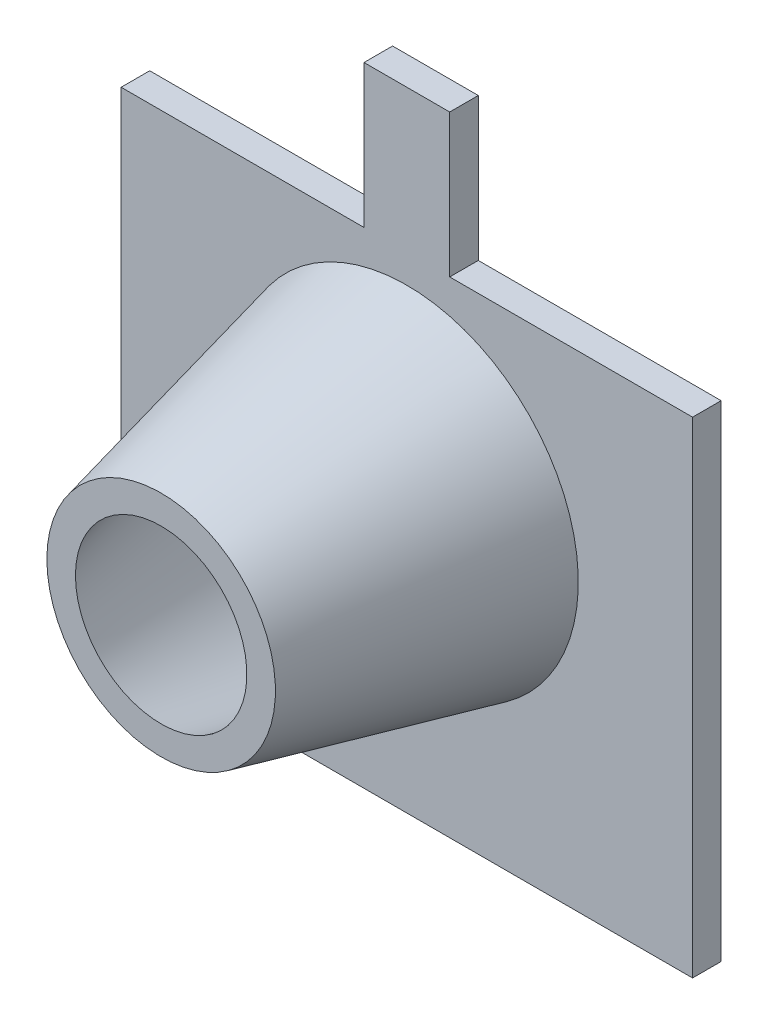
ISO-10303-21;
HEADER;
FILE_DESCRIPTION(('STEP AP214'),'2;1');
FILE_NAME('part.step','',(''),(''),'','','');
FILE_SCHEMA(('AUTOMOTIVE_DESIGN { 1 0 10303 214 1 1 1 1 }'));
ENDSEC;
DATA;
#1=APPLICATION_CONTEXT('core data for automotive mechanical design processes');
#2=APPLICATION_PROTOCOL_DEFINITION('international standard','automotive_design',2000,#1);
#3=PRODUCT_CONTEXT('',#1,'mechanical');
#4=PRODUCT('Part','Part','',(#3));
#5=PRODUCT_RELATED_PRODUCT_CATEGORY('part','',(#4));
#6=PRODUCT_DEFINITION_FORMATION('','',#4);
#7=PRODUCT_DEFINITION_CONTEXT('part definition',#1,'design');
#8=PRODUCT_DEFINITION('design','',#6,#7);
#9=PRODUCT_DEFINITION_SHAPE('','',#8);
#10=(LENGTH_UNIT() NAMED_UNIT(*) SI_UNIT(.MILLI.,.METRE.));
#11=(NAMED_UNIT(*) PLANE_ANGLE_UNIT() SI_UNIT($,.RADIAN.));
#12=(NAMED_UNIT(*) SI_UNIT($,.STERADIAN.) SOLID_ANGLE_UNIT());
#13=UNCERTAINTY_MEASURE_WITH_UNIT(LENGTH_MEASURE(1.E-05),#10,'distance_accuracy_value','');
#14=(GEOMETRIC_REPRESENTATION_CONTEXT(3) GLOBAL_UNCERTAINTY_ASSIGNED_CONTEXT((#13)) GLOBAL_UNIT_ASSIGNED_CONTEXT((#10,
#11,#12)) REPRESENTATION_CONTEXT('',''));
#15=CARTESIAN_POINT('',(0.,0.,0.));
#16=DIRECTION('',(0.,0.,1.));
#17=DIRECTION('',(1.,0.,0.));
#18=AXIS2_PLACEMENT_3D('',#15,#16,#17);
#19=CARTESIAN_POINT('',(0.,10.45,0.));
#20=DIRECTION('',(0.,1.,0.));
#21=DIRECTION('',(0.,0.,1.));
#22=AXIS2_PLACEMENT_3D('',#19,#20,#21);
#23=PLANE('',#22);
#24=DIRECTION('',(0.,0.,1.));
#25=VECTOR('',#24,1.);
#26=CARTESIAN_POINT('',(24.95,10.45,-65.35));
#27=LINE('',#26,#25);
#28=CARTESIAN_POINT('',(24.95,10.45,-65.35));
#29=VERTEX_POINT('',#28);
#30=CARTESIAN_POINT('',(24.95,10.45,-64.85));
#31=VERTEX_POINT('',#30);
#32=EDGE_CURVE('E56',#29,#31,#27,.T.);
#33=ORIENTED_EDGE('',*,*,#32,.F.);
#34=DIRECTION('',(-1.,0.,0.));
#35=VECTOR('',#34,1.);
#36=CARTESIAN_POINT('',(30.7,10.45,-65.35));
#37=LINE('',#36,#35);
#38=CARTESIAN_POINT('',(20.7,10.45,-65.35));
#39=VERTEX_POINT('',#38);
#40=EDGE_CURVE('E145',#29,#39,#37,.T.);
#41=ORIENTED_EDGE('',*,*,#40,.T.);
#42=DIRECTION('',(0.,0.,1.));
#43=VECTOR('',#42,1.);
#44=CARTESIAN_POINT('',(20.7,10.45,-65.35));
#45=LINE('',#44,#43);
#46=CARTESIAN_POINT('',(20.7,10.45,-64.85));
#47=VERTEX_POINT('',#46);
#48=EDGE_CURVE('E136',#39,#47,#45,.T.);
#49=ORIENTED_EDGE('',*,*,#48,.T.);
#50=DIRECTION('',(1.,0.,0.));
#51=VECTOR('',#50,1.);
#52=CARTESIAN_POINT('',(20.7,10.45,-64.85));
#53=LINE('',#52,#51);
#54=EDGE_CURVE('E141',#47,#31,#53,.T.);
#55=ORIENTED_EDGE('',*,*,#54,.T.);
#56=EDGE_LOOP('',(#33,#41,#49,#55));
#57=FACE_BOUND('',#56,.T.);
#58=ADVANCED_FACE('F41',(#57),#23,.T.);
#59=CARTESIAN_POINT('',(20.7,10.45,-65.35));
#60=DIRECTION('',(1.,0.,0.));
#61=DIRECTION('',(0.,0.,-1.));
#62=AXIS2_PLACEMENT_3D('',#59,#60,#61);
#63=PLANE('',#62);
#64=DIRECTION('',(0.,0.,1.));
#65=VECTOR('',#64,1.);
#66=CARTESIAN_POINT('',(20.7,1.95,-65.35));
#67=LINE('',#66,#65);
#68=CARTESIAN_POINT('',(20.7,1.95,-65.35));
#69=VERTEX_POINT('',#68);
#70=CARTESIAN_POINT('',(20.7,1.95,-64.85));
#71=VERTEX_POINT('',#70);
#72=EDGE_CURVE('E127',#69,#71,#67,.T.);
#73=ORIENTED_EDGE('',*,*,#72,.T.);
#74=DIRECTION('',(0.,-1.,0.));
#75=VECTOR('',#74,1.);
#76=CARTESIAN_POINT('',(20.7,10.45,-64.85));
#77=LINE('',#76,#75);
#78=EDGE_CURVE('E161',#47,#71,#77,.T.);
#79=ORIENTED_EDGE('',*,*,#78,.F.);
#80=ORIENTED_EDGE('',*,*,#48,.F.);
#81=DIRECTION('',(0.,-1.,0.));
#82=VECTOR('',#81,1.);
#83=CARTESIAN_POINT('',(20.7,10.45,-65.35));
#84=LINE('',#83,#82);
#85=EDGE_CURVE('E147',#39,#69,#84,.T.);
#86=ORIENTED_EDGE('',*,*,#85,.T.);
#87=EDGE_LOOP('',(#73,#79,#80,#86));
#88=FACE_BOUND('',#87,.T.);
#89=ADVANCED_FACE('F43',(#88),#63,.F.);
#90=CARTESIAN_POINT('',(20.7,10.45,-64.85));
#91=DIRECTION('',(0.,0.,-1.));
#92=DIRECTION('',(-1.,0.,0.));
#93=AXIS2_PLACEMENT_3D('',#90,#91,#92);
#94=PLANE('',#93);
#95=CARTESIAN_POINT('',(25.7,6.95,-64.85));
#96=DIRECTION('',(0.,0.,-1.));
#97=DIRECTION('',(-1.,0.,0.));
#98=AXIS2_PLACEMENT_3D('',#95,#96,#97);
#99=CIRCLE('',#98,3.);
#100=CARTESIAN_POINT('',(22.7,6.95,-64.85));
#101=VERTEX_POINT('',#100);
#102=EDGE_CURVE('E49',#101,#101,#99,.F.);
#103=ORIENTED_EDGE('',*,*,#102,.F.);
#104=EDGE_LOOP('',(#103));
#105=FACE_BOUND('',#104,.T.);
#106=DIRECTION('',(1.,0.,0.));
#107=VECTOR('',#106,1.);
#108=CARTESIAN_POINT('',(20.7,1.95,-64.85));
#109=LINE('',#108,#107);
#110=CARTESIAN_POINT('',(30.7,1.95,-64.85));
#111=VERTEX_POINT('',#110);
#112=EDGE_CURVE('E130',#71,#111,#109,.T.);
#113=ORIENTED_EDGE('',*,*,#112,.T.);
#114=DIRECTION('',(0.,-1.,0.));
#115=VECTOR('',#114,1.);
#116=CARTESIAN_POINT('',(30.7,10.45,-64.85));
#117=LINE('',#116,#115);
#118=CARTESIAN_POINT('',(30.7,10.45,-64.85));
#119=VERTEX_POINT('',#118);
#120=EDGE_CURVE('E158',#119,#111,#117,.T.);
#121=ORIENTED_EDGE('',*,*,#120,.F.);
#122=CARTESIAN_POINT('',(26.45,10.45,-64.85));
#123=VERTEX_POINT('',#122);
#124=EDGE_CURVE('E139',#123,#119,#53,.T.);
#125=ORIENTED_EDGE('',*,*,#124,.F.);
#126=DIRECTION('',(0.,-1.,0.));
#127=VECTOR('',#126,1.);
#128=CARTESIAN_POINT('',(26.45,12.95,-64.85));
#129=LINE('',#128,#127);
#130=CARTESIAN_POINT('',(26.45,12.95,-64.85));
#131=VERTEX_POINT('',#130);
#132=EDGE_CURVE('E112',#131,#123,#129,.T.);
#133=ORIENTED_EDGE('',*,*,#132,.F.);
#134=DIRECTION('',(1.,0.,0.));
#135=VECTOR('',#134,1.);
#136=CARTESIAN_POINT('',(24.95,12.95,-64.85));
#137=LINE('',#136,#135);
#138=CARTESIAN_POINT('',(24.95,12.95,-64.85));
#139=VERTEX_POINT('',#138);
#140=EDGE_CURVE('E106',#139,#131,#137,.T.);
#141=ORIENTED_EDGE('',*,*,#140,.F.);
#142=DIRECTION('',(0.,-1.,0.));
#143=VECTOR('',#142,1.);
#144=CARTESIAN_POINT('',(24.95,12.95,-64.85));
#145=LINE('',#144,#143);
#146=EDGE_CURVE('E110',#139,#31,#145,.T.);
#147=ORIENTED_EDGE('',*,*,#146,.T.);
#148=ORIENTED_EDGE('',*,*,#54,.F.);
#149=ORIENTED_EDGE('',*,*,#78,.T.);
#150=EDGE_LOOP('',(#113,#121,#125,#133,#141,#147,#148,#149));
#151=FACE_BOUND('',#150,.T.);
#152=ADVANCED_FACE('F108',(#105,#151),#94,.F.);
#153=CARTESIAN_POINT('',(30.7,10.45,-64.85));
#154=DIRECTION('',(-1.,0.,0.));
#155=DIRECTION('',(0.,0.,1.));
#156=AXIS2_PLACEMENT_3D('',#153,#154,#155);
#157=PLANE('',#156);
#158=DIRECTION('',(0.,0.,-1.));
#159=VECTOR('',#158,1.);
#160=CARTESIAN_POINT('',(30.7,1.95,-64.85));
#161=LINE('',#160,#159);
#162=CARTESIAN_POINT('',(30.7,1.95,-65.35));
#163=VERTEX_POINT('',#162);
#164=EDGE_CURVE('E150',#111,#163,#161,.T.);
#165=ORIENTED_EDGE('',*,*,#164,.T.);
#166=DIRECTION('',(0.,-1.,0.));
#167=VECTOR('',#166,1.);
#168=CARTESIAN_POINT('',(30.7,10.45,-65.35));
#169=LINE('',#168,#167);
#170=CARTESIAN_POINT('',(30.7,10.45,-65.35));
#171=VERTEX_POINT('',#170);
#172=EDGE_CURVE('E155',#171,#163,#169,.T.);
#173=ORIENTED_EDGE('',*,*,#172,.F.);
#174=DIRECTION('',(0.,0.,-1.));
#175=VECTOR('',#174,1.);
#176=CARTESIAN_POINT('',(30.7,10.45,-64.85));
#177=LINE('',#176,#175);
#178=EDGE_CURVE('E143',#119,#171,#177,.T.);
#179=ORIENTED_EDGE('',*,*,#178,.F.);
#180=ORIENTED_EDGE('',*,*,#120,.T.);
#181=EDGE_LOOP('',(#165,#173,#179,#180));
#182=FACE_BOUND('',#181,.T.);
#183=ADVANCED_FACE('F170',(#182),#157,.F.);
#184=CARTESIAN_POINT('',(30.7,10.45,-65.35));
#185=DIRECTION('',(0.,0.,1.));
#186=DIRECTION('',(1.,0.,0.));
#187=AXIS2_PLACEMENT_3D('',#184,#185,#186);
#188=PLANE('',#187);
#189=DIRECTION('',(-1.,0.,0.));
#190=VECTOR('',#189,1.);
#191=CARTESIAN_POINT('',(30.7,1.95,-65.35));
#192=LINE('',#191,#190);
#193=EDGE_CURVE('E140',#163,#69,#192,.T.);
#194=ORIENTED_EDGE('',*,*,#193,.T.);
#195=ORIENTED_EDGE('',*,*,#85,.F.);
#196=ORIENTED_EDGE('',*,*,#40,.F.);
#197=DIRECTION('',(0.,-1.,0.));
#198=VECTOR('',#197,1.);
#199=CARTESIAN_POINT('',(24.95,12.95,-65.35));
#200=LINE('',#199,#198);
#201=CARTESIAN_POINT('',(24.95,12.95,-65.35));
#202=VERTEX_POINT('',#201);
#203=EDGE_CURVE('E213',#202,#29,#200,.T.);
#204=ORIENTED_EDGE('',*,*,#203,.F.);
#205=DIRECTION('',(-1.,0.,0.));
#206=VECTOR('',#205,1.);
#207=CARTESIAN_POINT('',(26.45,12.95,-65.35));
#208=LINE('',#207,#206);
#209=CARTESIAN_POINT('',(26.45,12.95,-65.35));
#210=VERTEX_POINT('',#209);
#211=EDGE_CURVE('E121',#210,#202,#208,.T.);
#212=ORIENTED_EDGE('',*,*,#211,.F.);
#213=DIRECTION('',(0.,-1.,0.));
#214=VECTOR('',#213,1.);
#215=CARTESIAN_POINT('',(26.45,12.95,-65.35));
#216=LINE('',#215,#214);
#217=CARTESIAN_POINT('',(26.45,10.45,-65.35));
#218=VERTEX_POINT('',#217);
#219=EDGE_CURVE('E132',#210,#218,#216,.T.);
#220=ORIENTED_EDGE('',*,*,#219,.T.);
#221=EDGE_CURVE('E146',#171,#218,#37,.T.);
#222=ORIENTED_EDGE('',*,*,#221,.F.);
#223=ORIENTED_EDGE('',*,*,#172,.T.);
#224=EDGE_LOOP('',(#194,#195,#196,#204,#212,#220,#222,#223));
#225=FACE_BOUND('',#224,.T.);
#226=ADVANCED_FACE('F177',(#225),#188,.F.);
#227=DIRECTION('',(0.,0.,-1.));
#228=VECTOR('',#227,1.);
#229=CARTESIAN_POINT('',(26.45,10.45,-64.85));
#230=LINE('',#229,#228);
#231=EDGE_CURVE('E64',#123,#218,#230,.T.);
#232=ORIENTED_EDGE('',*,*,#231,.F.);
#233=ORIENTED_EDGE('',*,*,#124,.T.);
#234=ORIENTED_EDGE('',*,*,#178,.T.);
#235=ORIENTED_EDGE('',*,*,#221,.T.);
#236=EDGE_LOOP('',(#232,#233,#234,#235));
#237=FACE_BOUND('',#236,.T.);
#238=ADVANCED_FACE('F187',(#237),#23,.T.);
#239=CARTESIAN_POINT('',(0.,1.95,0.));
#240=DIRECTION('',(0.,1.,0.));
#241=DIRECTION('',(0.,0.,1.));
#242=AXIS2_PLACEMENT_3D('',#239,#240,#241);
#243=PLANE('',#242);
#244=ORIENTED_EDGE('',*,*,#72,.F.);
#245=ORIENTED_EDGE('',*,*,#193,.F.);
#246=ORIENTED_EDGE('',*,*,#164,.F.);
#247=ORIENTED_EDGE('',*,*,#112,.F.);
#248=EDGE_LOOP('',(#244,#245,#246,#247));
#249=FACE_BOUND('',#248,.T.);
#250=ADVANCED_FACE('F195',(#249),#243,.F.);
#251=CARTESIAN_POINT('',(24.95,12.95,-65.35));
#252=DIRECTION('',(1.,0.,0.));
#253=DIRECTION('',(0.,0.,-1.));
#254=AXIS2_PLACEMENT_3D('',#251,#252,#253);
#255=PLANE('',#254);
#256=ORIENTED_EDGE('',*,*,#32,.T.);
#257=ORIENTED_EDGE('',*,*,#146,.F.);
#258=DIRECTION('',(0.,0.,1.));
#259=VECTOR('',#258,1.);
#260=CARTESIAN_POINT('',(24.95,12.95,-65.35));
#261=LINE('',#260,#259);
#262=EDGE_CURVE('E116',#202,#139,#261,.T.);
#263=ORIENTED_EDGE('',*,*,#262,.F.);
#264=ORIENTED_EDGE('',*,*,#203,.T.);
#265=EDGE_LOOP('',(#256,#257,#263,#264));
#266=FACE_BOUND('',#265,.T.);
#267=ADVANCED_FACE('F126',(#266),#255,.F.);
#268=CARTESIAN_POINT('',(26.45,12.95,-64.85));
#269=DIRECTION('',(-1.,0.,0.));
#270=DIRECTION('',(0.,0.,1.));
#271=AXIS2_PLACEMENT_3D('',#268,#269,#270);
#272=PLANE('',#271);
#273=ORIENTED_EDGE('',*,*,#231,.T.);
#274=ORIENTED_EDGE('',*,*,#219,.F.);
#275=DIRECTION('',(0.,0.,-1.));
#276=VECTOR('',#275,1.);
#277=CARTESIAN_POINT('',(26.45,12.95,-64.85));
#278=LINE('',#277,#276);
#279=EDGE_CURVE('E115',#131,#210,#278,.T.);
#280=ORIENTED_EDGE('',*,*,#279,.F.);
#281=ORIENTED_EDGE('',*,*,#132,.T.);
#282=EDGE_LOOP('',(#273,#274,#280,#281));
#283=FACE_BOUND('',#282,.T.);
#284=ADVANCED_FACE('F237',(#283),#272,.F.);
#285=CARTESIAN_POINT('',(0.,12.95,0.));
#286=DIRECTION('',(0.,1.,0.));
#287=DIRECTION('',(0.,0.,1.));
#288=AXIS2_PLACEMENT_3D('',#285,#286,#287);
#289=PLANE('',#288);
#290=ORIENTED_EDGE('',*,*,#262,.T.);
#291=ORIENTED_EDGE('',*,*,#140,.T.);
#292=ORIENTED_EDGE('',*,*,#279,.T.);
#293=ORIENTED_EDGE('',*,*,#211,.T.);
#294=EDGE_LOOP('',(#290,#291,#292,#293));
#295=FACE_BOUND('',#294,.T.);
#296=ADVANCED_FACE('F119',(#295),#289,.T.);
#297=CARTESIAN_POINT('',(25.7,6.95,-64.85));
#298=DIRECTION('',(0.,0.,-1.));
#299=DIRECTION('',(-1.,0.,0.));
#300=AXIS2_PLACEMENT_3D('',#297,#298,#299);
#301=CONICAL_SURFACE('',#300,2.5,0.228496639291863);
#302=CARTESIAN_POINT('',(25.7,6.95,-60.55));
#303=DIRECTION('',(0.,0.,-1.));
#304=DIRECTION('',(-1.,0.,0.));
#305=AXIS2_PLACEMENT_3D('',#302,#303,#304);
#306=CIRCLE('',#305,1.5);
#307=CARTESIAN_POINT('',(24.2,6.95,-60.55));
#308=VERTEX_POINT('',#307);
#309=EDGE_CURVE('E224',#308,#308,#306,.T.);
#310=ORIENTED_EDGE('',*,*,#309,.F.);
#311=EDGE_LOOP('',(#310));
#312=FACE_BOUND('',#311,.T.);
#313=CARTESIAN_POINT('',(25.7,6.95,-64.85));
#314=DIRECTION('',(0.,0.,-1.));
#315=DIRECTION('',(-1.,0.,0.));
#316=AXIS2_PLACEMENT_3D('',#313,#314,#315);
#317=CIRCLE('',#316,2.5);
#318=CARTESIAN_POINT('',(23.2,6.95,-64.85));
#319=VERTEX_POINT('',#318);
#320=EDGE_CURVE('E11',#319,#319,#317,.T.);
#321=ORIENTED_EDGE('',*,*,#320,.T.);
#322=EDGE_LOOP('',(#321));
#323=FACE_BOUND('',#322,.T.);
#324=ADVANCED_FACE('F229',(#312,#323),#301,.F.);
#325=CARTESIAN_POINT('',(25.7,6.95,-60.55));
#326=DIRECTION('',(0.,0.,-1.));
#327=DIRECTION('',(-1.,0.,0.));
#328=AXIS2_PLACEMENT_3D('',#325,#326,#327);
#329=CONICAL_SURFACE('',#328,2.,0.228496639291863);
#330=ORIENTED_EDGE('',*,*,#102,.T.);
#331=EDGE_LOOP('',(#330));
#332=FACE_BOUND('',#331,.T.);
#333=CARTESIAN_POINT('',(25.7,6.95,-60.55));
#334=DIRECTION('',(0.,0.,-1.));
#335=DIRECTION('',(-1.,0.,0.));
#336=AXIS2_PLACEMENT_3D('',#333,#334,#335);
#337=CIRCLE('',#336,2.);
#338=CARTESIAN_POINT('',(23.7,6.95,-60.55));
#339=VERTEX_POINT('',#338);
#340=EDGE_CURVE('E219',#339,#339,#337,.T.);
#341=ORIENTED_EDGE('',*,*,#340,.T.);
#342=EDGE_LOOP('',(#341));
#343=FACE_BOUND('',#342,.T.);
#344=ADVANCED_FACE('F166',(#332,#343),#329,.T.);
#345=CARTESIAN_POINT('',(27.7,6.95,-60.55));
#346=DIRECTION('',(0.,0.,-1.));
#347=DIRECTION('',(-1.,0.,0.));
#348=AXIS2_PLACEMENT_3D('',#345,#346,#347);
#349=PLANE('',#348);
#350=ORIENTED_EDGE('',*,*,#340,.F.);
#351=EDGE_LOOP('',(#350));
#352=FACE_BOUND('',#351,.T.);
#353=ORIENTED_EDGE('',*,*,#309,.T.);
#354=EDGE_LOOP('',(#353));
#355=FACE_BOUND('',#354,.T.);
#356=ADVANCED_FACE('F183',(#352,#355),#349,.F.);
#357=ORIENTED_EDGE('',*,*,#320,.F.);
#358=EDGE_LOOP('',(#357));
#359=FACE_BOUND('',#358,.T.);
#360=ADVANCED_FACE('F171',(#359),#94,.F.);
#361=CLOSED_SHELL('',(#58,#89,#152,#183,#226,#238,#250,#267,#284,#296,#324,#344,#356,#360));
#362=MANIFOLD_SOLID_BREP('B2',#361);
#363=ADVANCED_BREP_SHAPE_REPRESENTATION('',(#18,#362),#14);
#364=SHAPE_DEFINITION_REPRESENTATION(#9,#363);
ENDSEC;
END-ISO-10303-21;
